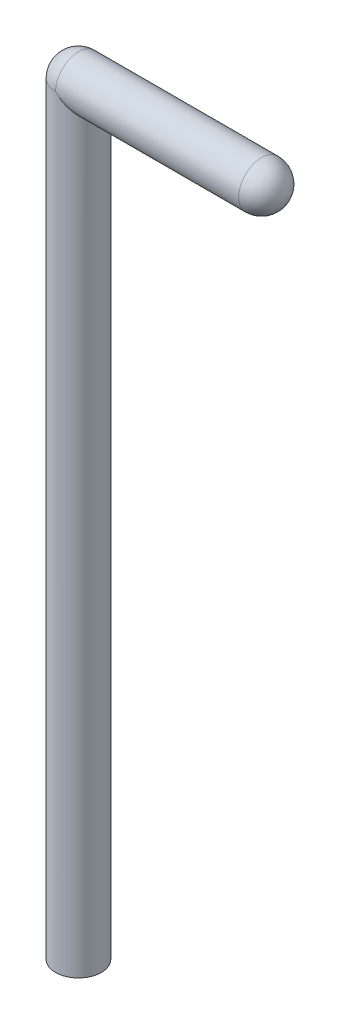
ISO-10303-21;
HEADER;
FILE_DESCRIPTION(('STEP AP214'),'2;1');
FILE_NAME('part.step','',(''),(''),'','','');
FILE_SCHEMA(('AUTOMOTIVE_DESIGN { 1 0 10303 214 1 1 1 1 }'));
ENDSEC;
DATA;
#1=APPLICATION_CONTEXT('core data for automotive mechanical design processes');
#2=APPLICATION_PROTOCOL_DEFINITION('international standard','automotive_design',2000,#1);
#3=PRODUCT_CONTEXT('',#1,'mechanical');
#4=PRODUCT('Part','Part','',(#3));
#5=PRODUCT_RELATED_PRODUCT_CATEGORY('part','',(#4));
#6=PRODUCT_DEFINITION_FORMATION('','',#4);
#7=PRODUCT_DEFINITION_CONTEXT('part definition',#1,'design');
#8=PRODUCT_DEFINITION('design','',#6,#7);
#9=PRODUCT_DEFINITION_SHAPE('','',#8);
#10=(LENGTH_UNIT() NAMED_UNIT(*) SI_UNIT(.MILLI.,.METRE.));
#11=(NAMED_UNIT(*) PLANE_ANGLE_UNIT() SI_UNIT($,.RADIAN.));
#12=(NAMED_UNIT(*) SI_UNIT($,.STERADIAN.) SOLID_ANGLE_UNIT());
#13=UNCERTAINTY_MEASURE_WITH_UNIT(LENGTH_MEASURE(1.E-05),#10,'distance_accuracy_value','');
#14=(GEOMETRIC_REPRESENTATION_CONTEXT(3) GLOBAL_UNCERTAINTY_ASSIGNED_CONTEXT((#13)) GLOBAL_UNIT_ASSIGNED_CONTEXT((#10,
#11,#12)) REPRESENTATION_CONTEXT('',''));
#15=CARTESIAN_POINT('',(0.,0.,0.));
#16=DIRECTION('',(0.,0.,1.));
#17=DIRECTION('',(1.,0.,0.));
#18=AXIS2_PLACEMENT_3D('',#15,#16,#17);
#19=CARTESIAN_POINT('',(0.,25.,0.));
#20=DIRECTION('',(0.,-1.,0.));
#21=DIRECTION('',(0.,0.,-1.));
#22=AXIS2_PLACEMENT_3D('',#19,#20,#21);
#23=CYLINDRICAL_SURFACE('',#22,0.75);
#24=CARTESIAN_POINT('',(0.,0.,0.));
#25=DIRECTION('',(0.,1.,0.));
#26=DIRECTION('',(0.,0.,1.));
#27=AXIS2_PLACEMENT_3D('',#24,#25,#26);
#28=CIRCLE('',#27,0.75);
#29=CARTESIAN_POINT('',(0.,0.,0.75));
#30=VERTEX_POINT('',#29);
#31=EDGE_CURVE('E37',#30,#30,#28,.T.);
#32=ORIENTED_EDGE('',*,*,#31,.T.);
#33=EDGE_LOOP('',(#32));
#34=FACE_BOUND('',#33,.T.);
#35=CARTESIAN_POINT('',(0.,25.,0.));
#36=DIRECTION('',(-0.707106781186547,-0.707106781186547,0.));
#37=DIRECTION('',(0.707106781186547,-0.707106781186547,0.));
#38=AXIS2_PLACEMENT_3D('',#35,#36,#37);
#39=ELLIPSE('',#38,1.06066017177982,0.75);
#40=CARTESIAN_POINT('',(0.,25.,0.75));
#41=VERTEX_POINT('',#40);
#42=CARTESIAN_POINT('',(0.,25.,-0.75));
#43=VERTEX_POINT('',#42);
#44=EDGE_CURVE('E52',#41,#43,#39,.F.);
#45=ORIENTED_EDGE('',*,*,#44,.F.);
#46=CARTESIAN_POINT('',(0.,25.,0.));
#47=DIRECTION('',(0.,1.,0.));
#48=DIRECTION('',(0.,0.,1.));
#49=AXIS2_PLACEMENT_3D('',#46,#47,#48);
#50=CIRCLE('',#49,0.75);
#51=EDGE_CURVE('E11',#43,#41,#50,.T.);
#52=ORIENTED_EDGE('',*,*,#51,.F.);
#53=EDGE_LOOP('',(#45,#52));
#54=FACE_BOUND('',#53,.T.);
#55=ADVANCED_FACE('F34',(#34,#54),#23,.T.);
#56=CARTESIAN_POINT('',(0.,25.,0.));
#57=DIRECTION('',(0.,1.,0.));
#58=DIRECTION('',(1.,0.,0.));
#59=AXIS2_PLACEMENT_3D('',#56,#57,#58);
#60=SPHERICAL_SURFACE('',#59,0.750000000000001);
#61=CARTESIAN_POINT('',(0.,25.,0.));
#62=DIRECTION('',(1.,0.,0.));
#63=DIRECTION('',(0.,0.,-1.));
#64=AXIS2_PLACEMENT_3D('',#61,#62,#63);
#65=CIRCLE('',#64,0.75);
#66=EDGE_CURVE('E46',#43,#41,#65,.T.);
#67=ORIENTED_EDGE('',*,*,#66,.F.);
#68=ORIENTED_EDGE('',*,*,#51,.T.);
#69=EDGE_LOOP('',(#67,#68));
#70=FACE_BOUND('',#69,.T.);
#71=ADVANCED_FACE('F49',(#70),#60,.T.);
#72=CARTESIAN_POINT('',(0.,0.,0.));
#73=DIRECTION('',(0.,1.,0.));
#74=DIRECTION('',(0.,0.,1.));
#75=AXIS2_PLACEMENT_3D('',#72,#73,#74);
#76=PLANE('',#75);
#77=ORIENTED_EDGE('',*,*,#31,.F.);
#78=EDGE_LOOP('',(#77));
#79=FACE_BOUND('',#78,.T.);
#80=ADVANCED_FACE('F65',(#79),#76,.F.);
#81=CARTESIAN_POINT('',(6.,25.,0.));
#82=DIRECTION('',(-1.,0.,0.));
#83=DIRECTION('',(0.,0.,1.));
#84=AXIS2_PLACEMENT_3D('',#81,#82,#83);
#85=CYLINDRICAL_SURFACE('',#84,0.75);
#86=CARTESIAN_POINT('',(6.,25.,0.));
#87=DIRECTION('',(1.,0.,0.));
#88=DIRECTION('',(0.,0.,-1.));
#89=AXIS2_PLACEMENT_3D('',#86,#87,#88);
#90=CIRCLE('',#89,0.75);
#91=CARTESIAN_POINT('',(6.,25.,-0.75));
#92=VERTEX_POINT('',#91);
#93=EDGE_CURVE('E54',#92,#92,#90,.T.);
#94=ORIENTED_EDGE('',*,*,#93,.F.);
#95=EDGE_LOOP('',(#94));
#96=FACE_BOUND('',#95,.T.);
#97=ORIENTED_EDGE('',*,*,#66,.T.);
#98=ORIENTED_EDGE('',*,*,#44,.T.);
#99=EDGE_LOOP('',(#97,#98));
#100=FACE_BOUND('',#99,.T.);
#101=ADVANCED_FACE('F56',(#96,#100),#85,.T.);
#102=CARTESIAN_POINT('',(6.,25.,0.));
#103=DIRECTION('',(0.,1.,0.));
#104=DIRECTION('',(0.,0.,1.));
#105=AXIS2_PLACEMENT_3D('',#102,#103,#104);
#106=SPHERICAL_SURFACE('',#105,0.750000000000001);
#107=CARTESIAN_POINT('',(6.,25.,0.));
#108=DIRECTION('',(1.,0.,0.));
#109=DIRECTION('',(0.,0.,-1.));
#110=AXIS2_PLACEMENT_3D('',#107,#108,#109);
#111=SPHERICAL_SURFACE('',#110,0.750000000000001);
#112=ORIENTED_EDGE('',*,*,#93,.T.);
#113=EDGE_LOOP('',(#112));
#114=FACE_BOUND('',#113,.T.);
#115=ADVANCED_FACE('F62',(#114),#111,.T.);
#116=CLOSED_SHELL('',(#55,#71,#80,#101,#115));
#117=MANIFOLD_SOLID_BREP('B2',#116);
#118=ADVANCED_BREP_SHAPE_REPRESENTATION('',(#18,#117),#14);
#119=SHAPE_DEFINITION_REPRESENTATION(#9,#118);
ENDSEC;
END-ISO-10303-21;
